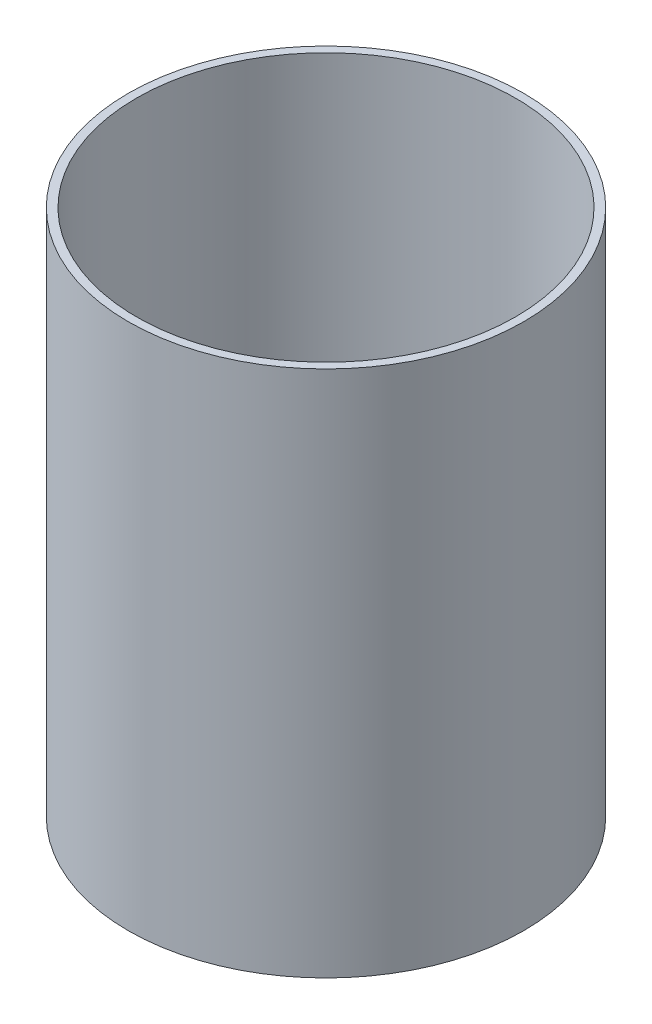
ISO-10303-21;
HEADER;
FILE_DESCRIPTION(('STEP AP214'),'2;1');
FILE_NAME('part.step','',(''),(''),'','','');
FILE_SCHEMA(('AUTOMOTIVE_DESIGN { 1 0 10303 214 1 1 1 1 }'));
ENDSEC;
DATA;
#1=APPLICATION_CONTEXT('core data for automotive mechanical design processes');
#2=APPLICATION_PROTOCOL_DEFINITION('international standard','automotive_design',2000,#1);
#3=PRODUCT_CONTEXT('',#1,'mechanical');
#4=PRODUCT('Part','Part','',(#3));
#5=PRODUCT_RELATED_PRODUCT_CATEGORY('part','',(#4));
#6=PRODUCT_DEFINITION_FORMATION('','',#4);
#7=PRODUCT_DEFINITION_CONTEXT('part definition',#1,'design');
#8=PRODUCT_DEFINITION('design','',#6,#7);
#9=PRODUCT_DEFINITION_SHAPE('','',#8);
#10=(LENGTH_UNIT() NAMED_UNIT(*) SI_UNIT(.MILLI.,.METRE.));
#11=(NAMED_UNIT(*) PLANE_ANGLE_UNIT() SI_UNIT($,.RADIAN.));
#12=(NAMED_UNIT(*) SI_UNIT($,.STERADIAN.) SOLID_ANGLE_UNIT());
#13=UNCERTAINTY_MEASURE_WITH_UNIT(LENGTH_MEASURE(1.E-05),#10,'distance_accuracy_value','');
#14=(GEOMETRIC_REPRESENTATION_CONTEXT(3) GLOBAL_UNCERTAINTY_ASSIGNED_CONTEXT((#13)) GLOBAL_UNIT_ASSIGNED_CONTEXT((#10,
#11,#12)) REPRESENTATION_CONTEXT('',''));
#15=CARTESIAN_POINT('',(0.,0.,0.));
#16=DIRECTION('',(0.,0.,1.));
#17=DIRECTION('',(1.,0.,0.));
#18=AXIS2_PLACEMENT_3D('',#15,#16,#17);
#19=CARTESIAN_POINT('',(38.1,101.6,0.));
#20=DIRECTION('',(0.,1.,0.));
#21=DIRECTION('',(-1.,0.,0.));
#22=AXIS2_PLACEMENT_3D('',#19,#20,#21);
#23=PLANE('',#22);
#24=CARTESIAN_POINT('',(-3.54734709488713E-13,101.6,0.));
#25=DIRECTION('',(0.,-1.,0.));
#26=DIRECTION('',(1.,0.,0.));
#27=AXIS2_PLACEMENT_3D('',#24,#25,#26);
#28=CIRCLE('',#27,36.5125000000004);
#29=CARTESIAN_POINT('',(36.5125,101.6,0.));
#30=VERTEX_POINT('',#29);
#31=EDGE_CURVE('E10',#30,#30,#28,.T.);
#32=ORIENTED_EDGE('',*,*,#31,.T.);
#33=EDGE_LOOP('',(#32));
#34=FACE_BOUND('',#33,.T.);
#35=CARTESIAN_POINT('',(-3.54734709488713E-13,101.6,0.));
#36=DIRECTION('',(0.,-1.,0.));
#37=DIRECTION('',(1.,0.,0.));
#38=AXIS2_PLACEMENT_3D('',#35,#36,#37);
#39=CIRCLE('',#38,38.1000000000004);
#40=CARTESIAN_POINT('',(38.1,101.6,0.));
#41=VERTEX_POINT('',#40);
#42=EDGE_CURVE('E43',#41,#41,#39,.T.);
#43=ORIENTED_EDGE('',*,*,#42,.F.);
#44=EDGE_LOOP('',(#43));
#45=FACE_BOUND('',#44,.T.);
#46=ADVANCED_FACE('F29',(#34,#45),#23,.T.);
#47=CARTESIAN_POINT('',(3.49148336110938E-12,-1000.,0.));
#48=DIRECTION('',(0.,-1.,0.));
#49=DIRECTION('',(1.,0.,0.));
#50=AXIS2_PLACEMENT_3D('',#47,#48,#49);
#51=CYLINDRICAL_SURFACE('',#50,36.5125000000002);
#52=CARTESIAN_POINT('',(0.,3.17499999999971,0.));
#53=DIRECTION('',(0.,-1.,0.));
#54=DIRECTION('',(1.,0.,0.));
#55=AXIS2_PLACEMENT_3D('',#52,#53,#54);
#56=CIRCLE('',#55,36.5125);
#57=CARTESIAN_POINT('',(36.5125,3.17499999999983,0.));
#58=VERTEX_POINT('',#57);
#59=EDGE_CURVE('E35',#58,#58,#56,.T.);
#60=ORIENTED_EDGE('',*,*,#59,.T.);
#61=EDGE_LOOP('',(#60));
#62=FACE_BOUND('',#61,.T.);
#63=ORIENTED_EDGE('',*,*,#31,.F.);
#64=EDGE_LOOP('',(#63));
#65=FACE_BOUND('',#64,.T.);
#66=ADVANCED_FACE('F53',(#62,#65),#51,.F.);
#67=CARTESIAN_POINT('',(36.5125,3.17500000000006,0.));
#68=DIRECTION('',(0.,1.,0.));
#69=DIRECTION('',(-1.,0.,0.));
#70=AXIS2_PLACEMENT_3D('',#67,#68,#69);
#71=PLANE('',#70);
#72=ORIENTED_EDGE('',*,*,#59,.F.);
#73=EDGE_LOOP('',(#72));
#74=FACE_BOUND('',#73,.T.);
#75=ADVANCED_FACE('F57',(#74),#71,.T.);
#76=CARTESIAN_POINT('',(0.,0.,0.));
#77=DIRECTION('',(0.,-1.,0.));
#78=DIRECTION('',(1.,0.,0.));
#79=AXIS2_PLACEMENT_3D('',#76,#77,#78);
#80=PLANE('',#79);
#81=CARTESIAN_POINT('',(0.,-1.11022302462516E-13,0.));
#82=DIRECTION('',(0.,-1.,0.));
#83=DIRECTION('',(1.,0.,0.));
#84=AXIS2_PLACEMENT_3D('',#81,#82,#83);
#85=CIRCLE('',#84,38.1);
#86=CARTESIAN_POINT('',(38.1,0.,0.));
#87=VERTEX_POINT('',#86);
#88=EDGE_CURVE('E39',#87,#87,#85,.T.);
#89=ORIENTED_EDGE('',*,*,#88,.T.);
#90=EDGE_LOOP('',(#89));
#91=FACE_BOUND('',#90,.T.);
#92=ADVANCED_FACE('F61',(#91),#80,.T.);
#93=CARTESIAN_POINT('',(3.49148336110938E-12,-1000.,0.));
#94=DIRECTION('',(0.,-1.,0.));
#95=DIRECTION('',(1.,0.,0.));
#96=AXIS2_PLACEMENT_3D('',#93,#94,#95);
#97=CYLINDRICAL_SURFACE('',#96,38.1000000000002);
#98=ORIENTED_EDGE('',*,*,#42,.T.);
#99=EDGE_LOOP('',(#98));
#100=FACE_BOUND('',#99,.T.);
#101=ORIENTED_EDGE('',*,*,#88,.F.);
#102=EDGE_LOOP('',(#101));
#103=FACE_BOUND('',#102,.T.);
#104=ADVANCED_FACE('F49',(#100,#103),#97,.T.);
#105=CLOSED_SHELL('',(#46,#66,#75,#92,#104));
#106=MANIFOLD_SOLID_BREP('B2',#105);
#107=ADVANCED_BREP_SHAPE_REPRESENTATION('',(#18,#106),#14);
#108=SHAPE_DEFINITION_REPRESENTATION(#9,#107);
ENDSEC;
END-ISO-10303-21;
